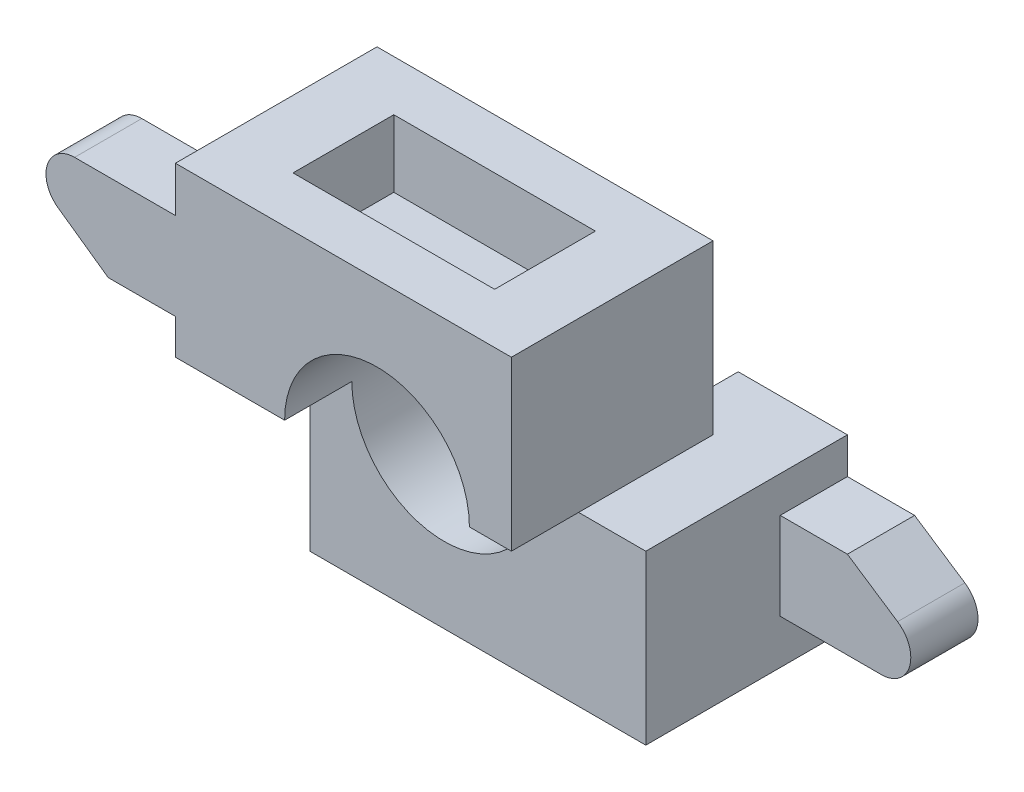
ISO-10303-21;
HEADER;
FILE_DESCRIPTION(('STEP AP214'),'2;1');
FILE_NAME('part.step','',(''),(''),'','','');
FILE_SCHEMA(('AUTOMOTIVE_DESIGN { 1 0 10303 214 1 1 1 1 }'));
ENDSEC;
DATA;
#1=APPLICATION_CONTEXT('core data for automotive mechanical design processes');
#2=APPLICATION_PROTOCOL_DEFINITION('international standard','automotive_design',2000,#1);
#3=PRODUCT_CONTEXT('',#1,'mechanical');
#4=PRODUCT('Part','Part','',(#3));
#5=PRODUCT_RELATED_PRODUCT_CATEGORY('part','',(#4));
#6=PRODUCT_DEFINITION_FORMATION('','',#4);
#7=PRODUCT_DEFINITION_CONTEXT('part definition',#1,'design');
#8=PRODUCT_DEFINITION('design','',#6,#7);
#9=PRODUCT_DEFINITION_SHAPE('','',#8);
#10=(LENGTH_UNIT() NAMED_UNIT(*) SI_UNIT(.MILLI.,.METRE.));
#11=(NAMED_UNIT(*) PLANE_ANGLE_UNIT() SI_UNIT($,.RADIAN.));
#12=(NAMED_UNIT(*) SI_UNIT($,.STERADIAN.) SOLID_ANGLE_UNIT());
#13=UNCERTAINTY_MEASURE_WITH_UNIT(LENGTH_MEASURE(1.E-05),#10,'distance_accuracy_value','');
#14=(GEOMETRIC_REPRESENTATION_CONTEXT(3) GLOBAL_UNCERTAINTY_ASSIGNED_CONTEXT((#13)) GLOBAL_UNIT_ASSIGNED_CONTEXT((#10,
#11,#12)) REPRESENTATION_CONTEXT('',''));
#15=CARTESIAN_POINT('',(0.,0.,0.));
#16=DIRECTION('',(0.,0.,1.));
#17=DIRECTION('',(1.,0.,0.));
#18=AXIS2_PLACEMENT_3D('',#15,#16,#17);
#19=CARTESIAN_POINT('',(0.,-10.7717179520605,-40.));
#20=DIRECTION('',(0.,-1.,0.));
#21=DIRECTION('',(1.,0.,0.));
#22=AXIS2_PLACEMENT_3D('',#19,#20,#21);
#23=PLANE('',#22);
#24=DIRECTION('',(-1.,0.,0.));
#25=VECTOR('',#24,1.);
#26=CARTESIAN_POINT('',(0.,-10.7717179520605,-20.));
#27=LINE('',#26,#25);
#28=CARTESIAN_POINT('',(80.,-10.7717179520605,-20.));
#29=VERTEX_POINT('',#28);
#30=CARTESIAN_POINT('',(60.,-10.7717179520605,-20.));
#31=VERTEX_POINT('',#30);
#32=EDGE_CURVE('E319',#29,#31,#27,.T.);
#33=ORIENTED_EDGE('',*,*,#32,.F.);
#34=DIRECTION('',(0.,0.,1.));
#35=VECTOR('',#34,1.);
#36=CARTESIAN_POINT('',(80.,-10.7717179520605,-40.));
#37=LINE('',#36,#35);
#38=CARTESIAN_POINT('',(80.,-10.7717179520605,-40.));
#39=VERTEX_POINT('',#38);
#40=EDGE_CURVE('E380',#39,#29,#37,.T.);
#41=ORIENTED_EDGE('',*,*,#40,.F.);
#42=DIRECTION('',(1.,0.,0.));
#43=VECTOR('',#42,1.);
#44=CARTESIAN_POINT('',(0.,-10.7717179520605,-40.));
#45=LINE('',#44,#43);
#46=CARTESIAN_POINT('',(60.,-10.7717179520605,-40.));
#47=VERTEX_POINT('',#46);
#48=EDGE_CURVE('E368',#47,#39,#45,.T.);
#49=ORIENTED_EDGE('',*,*,#48,.F.);
#50=DIRECTION('',(0.,0.,1.));
#51=VECTOR('',#50,1.);
#52=CARTESIAN_POINT('',(60.,-10.7717179520605,-40.));
#53=LINE('',#52,#51);
#54=EDGE_CURVE('E377',#47,#31,#53,.T.);
#55=ORIENTED_EDGE('',*,*,#54,.T.);
#56=EDGE_LOOP('',(#33,#41,#49,#55));
#57=FACE_BOUND('',#56,.T.);
#58=ADVANCED_FACE('F36',(#57),#23,.F.);
#59=CARTESIAN_POINT('',(19.5028414656665,29.3830059598299,-40.));
#60=DIRECTION('',(-0.553014165419757,-0.833171850727742,0.));
#61=DIRECTION('',(0.833171850727742,-0.553014165419757,0.));
#62=AXIS2_PLACEMENT_3D('',#59,#60,#61);
#63=PLANE('',#62);
#64=DIRECTION('',(-0.833171850727742,0.553014165419757,0.));
#65=VECTOR('',#64,1.);
#66=CARTESIAN_POINT('',(19.5028414656665,29.3830059598299,-20.));
#67=LINE('',#66,#65);
#68=CARTESIAN_POINT('',(94.9447578266245,-20.6912354797737,-20.));
#69=VERTEX_POINT('',#68);
#70=EDGE_CURVE('E313',#69,#29,#67,.T.);
#71=ORIENTED_EDGE('',*,*,#70,.F.);
#72=DIRECTION('',(0.,0.,1.));
#73=VECTOR('',#72,1.);
#74=CARTESIAN_POINT('',(94.9447578266245,-20.6912354797737,-40.));
#75=LINE('',#74,#73);
#76=CARTESIAN_POINT('',(94.9447578266245,-20.6912354797737,-40.));
#77=VERTEX_POINT('',#76);
#78=EDGE_CURVE('E383',#77,#69,#75,.T.);
#79=ORIENTED_EDGE('',*,*,#78,.F.);
#80=DIRECTION('',(0.833171850727742,-0.553014165419757,0.));
#81=VECTOR('',#80,1.);
#82=CARTESIAN_POINT('',(19.5028414656665,29.3830059598299,-40.));
#83=LINE('',#82,#81);
#84=EDGE_CURVE('E366',#39,#77,#83,.T.);
#85=ORIENTED_EDGE('',*,*,#84,.F.);
#86=ORIENTED_EDGE('',*,*,#40,.T.);
#87=EDGE_LOOP('',(#71,#79,#85,#86));
#88=FACE_BOUND('',#87,.T.);
#89=ADVANCED_FACE('F525',(#88),#63,.F.);
#90=CARTESIAN_POINT('',(90.0935973993104,-28.,-40.));
#91=DIRECTION('',(0.,0.,1.));
#92=DIRECTION('',(1.,0.,0.));
#93=AXIS2_PLACEMENT_3D('',#90,#91,#92);
#94=CYLINDRICAL_SURFACE('',#93,8.77221729687867);
#95=CARTESIAN_POINT('',(90.0935973993104,-28.,-20.));
#96=DIRECTION('',(0.,0.,1.));
#97=DIRECTION('',(1.,0.,0.));
#98=AXIS2_PLACEMENT_3D('',#95,#96,#97);
#99=CIRCLE('',#98,8.77221729687867);
#100=CARTESIAN_POINT('',(90.,-36.7717179520605,-20.));
#101=VERTEX_POINT('',#100);
#102=EDGE_CURVE('E327',#101,#69,#99,.T.);
#103=ORIENTED_EDGE('',*,*,#102,.F.);
#104=DIRECTION('',(0.,0.,1.));
#105=VECTOR('',#104,1.);
#106=CARTESIAN_POINT('',(90.,-36.7717179520605,-40.));
#107=LINE('',#106,#105);
#108=CARTESIAN_POINT('',(90.,-36.7717179520605,-40.));
#109=VERTEX_POINT('',#108);
#110=EDGE_CURVE('E386',#109,#101,#107,.T.);
#111=ORIENTED_EDGE('',*,*,#110,.F.);
#112=CARTESIAN_POINT('',(90.0935973993104,-28.,-40.));
#113=DIRECTION('',(0.,0.,1.));
#114=DIRECTION('',(1.,0.,0.));
#115=AXIS2_PLACEMENT_3D('',#112,#113,#114);
#116=CIRCLE('',#115,8.77221729687867);
#117=EDGE_CURVE('E364',#77,#109,#116,.F.);
#118=ORIENTED_EDGE('',*,*,#117,.F.);
#119=ORIENTED_EDGE('',*,*,#78,.T.);
#120=EDGE_LOOP('',(#103,#111,#118,#119));
#121=FACE_BOUND('',#120,.T.);
#122=ADVANCED_FACE('F521',(#121),#94,.T.);
#123=CARTESIAN_POINT('',(0.,-36.7717179520605,-40.));
#124=DIRECTION('',(0.,-1.,0.));
#125=DIRECTION('',(0.,0.,-1.));
#126=AXIS2_PLACEMENT_3D('',#123,#124,#125);
#127=PLANE('',#126);
#128=ORIENTED_EDGE('',*,*,#110,.T.);
#129=DIRECTION('',(-1.,0.,0.));
#130=VECTOR('',#129,1.);
#131=CARTESIAN_POINT('',(0.,-36.7717179520605,-20.));
#132=LINE('',#131,#130);
#133=CARTESIAN_POINT('',(60.,-36.7717179520605,-20.));
#134=VERTEX_POINT('',#133);
#135=EDGE_CURVE('E324',#101,#134,#132,.T.);
#136=ORIENTED_EDGE('',*,*,#135,.T.);
#137=DIRECTION('',(0.,0.,1.));
#138=VECTOR('',#137,1.);
#139=CARTESIAN_POINT('',(60.,-36.7717179520605,-40.));
#140=LINE('',#139,#138);
#141=CARTESIAN_POINT('',(60.,-36.7717179520605,-40.));
#142=VERTEX_POINT('',#141);
#143=EDGE_CURVE('E389',#142,#134,#140,.T.);
#144=ORIENTED_EDGE('',*,*,#143,.F.);
#145=DIRECTION('',(1.,0.,0.));
#146=VECTOR('',#145,1.);
#147=CARTESIAN_POINT('',(0.,-36.7717179520605,-40.));
#148=LINE('',#147,#146);
#149=EDGE_CURVE('E360',#142,#109,#148,.T.);
#150=ORIENTED_EDGE('',*,*,#149,.T.);
#151=EDGE_LOOP('',(#128,#136,#144,#150));
#152=FACE_BOUND('',#151,.T.);
#153=ADVANCED_FACE('F515',(#152),#127,.T.);
#154=CARTESIAN_POINT('',(0.,0.,-20.));
#155=DIRECTION('',(0.,0.,1.));
#156=DIRECTION('',(1.,0.,0.));
#157=AXIS2_PLACEMENT_3D('',#154,#155,#156);
#158=CYLINDRICAL_SURFACE('',#157,27.5);
#159=DIRECTION('',(0.,0.,1.));
#160=VECTOR('',#159,1.);
#161=CARTESIAN_POINT('',(-27.5,0.,-20.));
#162=LINE('',#161,#160);
#163=CARTESIAN_POINT('',(-27.5,0.,20.));
#164=VERTEX_POINT('',#163);
#165=CARTESIAN_POINT('',(-27.5,0.,40.));
#166=VERTEX_POINT('',#165);
#167=EDGE_CURVE('E12',#164,#166,#162,.T.);
#168=ORIENTED_EDGE('',*,*,#167,.F.);
#169=CARTESIAN_POINT('',(0.,0.,20.));
#170=DIRECTION('',(0.,0.,1.));
#171=DIRECTION('',(1.,0.,0.));
#172=AXIS2_PLACEMENT_3D('',#169,#170,#171);
#173=CIRCLE('',#172,27.5);
#174=CARTESIAN_POINT('',(27.5,0.,20.));
#175=VERTEX_POINT('',#174);
#176=EDGE_CURVE('E329',#164,#175,#173,.T.);
#177=ORIENTED_EDGE('',*,*,#176,.T.);
#178=DIRECTION('',(0.,0.,1.));
#179=VECTOR('',#178,1.);
#180=CARTESIAN_POINT('',(27.5,0.,-20.));
#181=LINE('',#180,#179);
#182=CARTESIAN_POINT('',(27.5,0.,40.));
#183=VERTEX_POINT('',#182);
#184=EDGE_CURVE('E40',#175,#183,#181,.T.);
#185=ORIENTED_EDGE('',*,*,#184,.T.);
#186=CARTESIAN_POINT('',(0.,0.,40.));
#187=DIRECTION('',(0.,0.,1.));
#188=DIRECTION('',(1.,0.,0.));
#189=AXIS2_PLACEMENT_3D('',#186,#187,#188);
#190=CIRCLE('',#189,27.5);
#191=EDGE_CURVE('E373',#183,#166,#190,.T.);
#192=ORIENTED_EDGE('',*,*,#191,.T.);
#193=EDGE_LOOP('',(#168,#177,#185,#192));
#194=FACE_BOUND('',#193,.T.);
#195=CARTESIAN_POINT('',(0.,0.,-20.));
#196=DIRECTION('',(0.,0.,1.));
#197=DIRECTION('',(1.,0.,0.));
#198=AXIS2_PLACEMENT_3D('',#195,#196,#197);
#199=CIRCLE('',#198,27.5);
#200=CARTESIAN_POINT('',(27.5,0.,-20.));
#201=VERTEX_POINT('',#200);
#202=CARTESIAN_POINT('',(-27.5,0.,-20.));
#203=VERTEX_POINT('',#202);
#204=EDGE_CURVE('E433',#201,#203,#199,.T.);
#205=ORIENTED_EDGE('',*,*,#204,.F.);
#206=DIRECTION('',(0.,0.,1.));
#207=VECTOR('',#206,1.);
#208=CARTESIAN_POINT('',(27.5,0.,-40.));
#209=LINE('',#208,#207);
#210=CARTESIAN_POINT('',(27.5,0.,-40.));
#211=VERTEX_POINT('',#210);
#212=EDGE_CURVE('E370',#211,#201,#209,.T.);
#213=ORIENTED_EDGE('',*,*,#212,.F.);
#214=CARTESIAN_POINT('',(0.,0.,-40.));
#215=DIRECTION('',(0.,0.,1.));
#216=DIRECTION('',(1.,0.,0.));
#217=AXIS2_PLACEMENT_3D('',#214,#215,#216);
#218=CIRCLE('',#217,27.5);
#219=CARTESIAN_POINT('',(-27.5,0.,-40.));
#220=VERTEX_POINT('',#219);
#221=EDGE_CURVE('E346',#220,#211,#218,.T.);
#222=ORIENTED_EDGE('',*,*,#221,.F.);
#223=DIRECTION('',(0.,0.,1.));
#224=VECTOR('',#223,1.);
#225=CARTESIAN_POINT('',(-27.5,0.,-40.));
#226=LINE('',#225,#224);
#227=EDGE_CURVE('E400',#220,#203,#226,.T.);
#228=ORIENTED_EDGE('',*,*,#227,.T.);
#229=EDGE_LOOP('',(#205,#213,#222,#228));
#230=FACE_BOUND('',#229,.T.);
#231=ADVANCED_FACE('F38',(#194,#230),#158,.F.);
#232=CARTESIAN_POINT('',(0.,0.,-20.));
#233=DIRECTION('',(0.,1.,0.));
#234=DIRECTION('',(-1.,0.,0.));
#235=AXIS2_PLACEMENT_3D('',#232,#233,#234);
#236=PLANE('',#235);
#237=DIRECTION('',(-1.,0.,0.));
#238=VECTOR('',#237,1.);
#239=CARTESIAN_POINT('',(0.,0.,-20.));
#240=LINE('',#239,#238);
#241=CARTESIAN_POINT('',(-40.,0.,-20.));
#242=VERTEX_POINT('',#241);
#243=CARTESIAN_POINT('',(-60.,0.,-20.));
#244=VERTEX_POINT('',#243);
#245=EDGE_CURVE('E447',#242,#244,#240,.T.);
#246=ORIENTED_EDGE('',*,*,#245,.F.);
#247=DIRECTION('',(0.,0.,1.));
#248=VECTOR('',#247,1.);
#249=CARTESIAN_POINT('',(-40.,0.,-40.));
#250=LINE('',#249,#248);
#251=CARTESIAN_POINT('',(-40.,0.,20.));
#252=VERTEX_POINT('',#251);
#253=EDGE_CURVE('E399',#242,#252,#250,.T.);
#254=ORIENTED_EDGE('',*,*,#253,.T.);
#255=DIRECTION('',(1.,0.,0.));
#256=VECTOR('',#255,1.);
#257=CARTESIAN_POINT('',(0.,0.,20.));
#258=LINE('',#257,#256);
#259=EDGE_CURVE('E333',#252,#164,#258,.T.);
#260=ORIENTED_EDGE('',*,*,#259,.T.);
#261=ORIENTED_EDGE('',*,*,#167,.T.);
#262=DIRECTION('',(-1.,0.,0.));
#263=VECTOR('',#262,1.);
#264=CARTESIAN_POINT('',(0.,0.,40.));
#265=LINE('',#264,#263);
#266=CARTESIAN_POINT('',(-60.,0.,40.));
#267=VERTEX_POINT('',#266);
#268=EDGE_CURVE('E430',#166,#267,#265,.T.);
#269=ORIENTED_EDGE('',*,*,#268,.T.);
#270=DIRECTION('',(0.,0.,1.));
#271=VECTOR('',#270,1.);
#272=CARTESIAN_POINT('',(-60.,0.,-20.));
#273=LINE('',#272,#271);
#274=EDGE_CURVE('E45',#244,#267,#273,.T.);
#275=ORIENTED_EDGE('',*,*,#274,.F.);
#276=EDGE_LOOP('',(#246,#254,#260,#261,#269,#275));
#277=FACE_BOUND('',#276,.T.);
#278=ADVANCED_FACE('F490',(#277),#236,.F.);
#279=CARTESIAN_POINT('',(-60.,0.,-20.));
#280=DIRECTION('',(1.,0.,0.));
#281=DIRECTION('',(0.,0.,-1.));
#282=AXIS2_PLACEMENT_3D('',#279,#280,#281);
#283=PLANE('',#282);
#284=ORIENTED_EDGE('',*,*,#274,.T.);
#285=DIRECTION('',(0.,1.,0.));
#286=VECTOR('',#285,1.);
#287=CARTESIAN_POINT('',(-60.,0.,40.));
#288=LINE('',#287,#286);
#289=CARTESIAN_POINT('',(-60.,10.5136614284726,40.));
#290=VERTEX_POINT('',#289);
#291=EDGE_CURVE('E418',#267,#290,#288,.T.);
#292=ORIENTED_EDGE('',*,*,#291,.T.);
#293=DIRECTION('',(0.,0.,1.));
#294=VECTOR('',#293,1.);
#295=CARTESIAN_POINT('',(-60.,10.5136614284726,-20.));
#296=LINE('',#295,#294);
#297=CARTESIAN_POINT('',(-60.,10.5136614284726,20.));
#298=VERTEX_POINT('',#297);
#299=EDGE_CURVE('E452',#298,#290,#296,.T.);
#300=ORIENTED_EDGE('',*,*,#299,.F.);
#301=DIRECTION('',(0.,1.,0.));
#302=VECTOR('',#301,1.);
#303=CARTESIAN_POINT('',(-60.,0.,20.));
#304=LINE('',#303,#302);
#305=CARTESIAN_POINT('',(-60.,36.5136614284726,20.));
#306=VERTEX_POINT('',#305);
#307=EDGE_CURVE('E308',#298,#306,#304,.T.);
#308=ORIENTED_EDGE('',*,*,#307,.T.);
#309=DIRECTION('',(0.,0.,1.));
#310=VECTOR('',#309,1.);
#311=CARTESIAN_POINT('',(-60.,36.5136614284726,-20.));
#312=LINE('',#311,#310);
#313=CARTESIAN_POINT('',(-60.,36.5136614284726,40.));
#314=VERTEX_POINT('',#313);
#315=EDGE_CURVE('E460',#306,#314,#312,.T.);
#316=ORIENTED_EDGE('',*,*,#315,.T.);
#317=CARTESIAN_POINT('',(-60.,50.,40.));
#318=VERTEX_POINT('',#317);
#319=EDGE_CURVE('E414',#314,#318,#288,.T.);
#320=ORIENTED_EDGE('',*,*,#319,.T.);
#321=DIRECTION('',(0.,0.,1.));
#322=VECTOR('',#321,1.);
#323=CARTESIAN_POINT('',(-60.,50.,-20.));
#324=LINE('',#323,#322);
#325=CARTESIAN_POINT('',(-60.,50.,-20.));
#326=VERTEX_POINT('',#325);
#327=EDGE_CURVE('E462',#326,#318,#324,.T.);
#328=ORIENTED_EDGE('',*,*,#327,.F.);
#329=DIRECTION('',(0.,1.,0.));
#330=VECTOR('',#329,1.);
#331=CARTESIAN_POINT('',(-60.,0.,-20.));
#332=LINE('',#331,#330);
#333=EDGE_CURVE('E445',#244,#326,#332,.T.);
#334=ORIENTED_EDGE('',*,*,#333,.F.);
#335=EDGE_LOOP('',(#284,#292,#300,#308,#316,#320,#328,#334));
#336=FACE_BOUND('',#335,.T.);
#337=ADVANCED_FACE('F546',(#336),#283,.F.);
#338=CARTESIAN_POINT('',(0.,10.5136614284726,-20.));
#339=DIRECTION('',(0.,1.,0.));
#340=DIRECTION('',(-1.,0.,0.));
#341=AXIS2_PLACEMENT_3D('',#338,#339,#340);
#342=PLANE('',#341);
#343=DIRECTION('',(0.,0.,1.));
#344=VECTOR('',#343,1.);
#345=CARTESIAN_POINT('',(-80.,10.5136614284726,-20.));
#346=LINE('',#345,#344);
#347=CARTESIAN_POINT('',(-80.,10.5136614284726,20.));
#348=VERTEX_POINT('',#347);
#349=CARTESIAN_POINT('',(-80.,10.5136614284726,40.));
#350=VERTEX_POINT('',#349);
#351=EDGE_CURVE('E454',#348,#350,#346,.T.);
#352=ORIENTED_EDGE('',*,*,#351,.F.);
#353=DIRECTION('',(-1.,0.,0.));
#354=VECTOR('',#353,1.);
#355=CARTESIAN_POINT('',(0.,10.5136614284726,20.));
#356=LINE('',#355,#354);
#357=EDGE_CURVE('E306',#298,#348,#356,.T.);
#358=ORIENTED_EDGE('',*,*,#357,.F.);
#359=ORIENTED_EDGE('',*,*,#299,.T.);
#360=DIRECTION('',(-1.,0.,0.));
#361=VECTOR('',#360,1.);
#362=CARTESIAN_POINT('',(0.,10.5136614284726,40.));
#363=LINE('',#362,#361);
#364=EDGE_CURVE('E427',#290,#350,#363,.T.);
#365=ORIENTED_EDGE('',*,*,#364,.T.);
#366=EDGE_LOOP('',(#352,#358,#359,#365));
#367=FACE_BOUND('',#366,.T.);
#368=ADVANCED_FACE('F561',(#367),#342,.F.);
#369=CARTESIAN_POINT('',(-21.6725627596517,-30.6839443658761,-20.));
#370=DIRECTION('',(0.576919615619184,0.81680092869304,0.));
#371=DIRECTION('',(-0.81680092869304,0.576919615619184,0.));
#372=AXIS2_PLACEMENT_3D('',#369,#370,#371);
#373=PLANE('',#372);
#374=DIRECTION('',(0.,0.,1.));
#375=VECTOR('',#374,1.);
#376=CARTESIAN_POINT('',(-94.9116982788263,21.0460334386454,-20.));
#377=LINE('',#376,#375);
#378=CARTESIAN_POINT('',(-94.9116982788263,21.0460334386454,20.));
#379=VERTEX_POINT('',#378);
#380=CARTESIAN_POINT('',(-94.9116982788263,21.0460334386454,40.));
#381=VERTEX_POINT('',#380);
#382=EDGE_CURVE('E456',#379,#381,#377,.T.);
#383=ORIENTED_EDGE('',*,*,#382,.F.);
#384=DIRECTION('',(-0.81680092869304,0.576919615619184,0.));
#385=VECTOR('',#384,1.);
#386=CARTESIAN_POINT('',(-21.6725627596517,-30.6839443658761,20.));
#387=LINE('',#386,#385);
#388=EDGE_CURVE('E300',#348,#379,#387,.T.);
#389=ORIENTED_EDGE('',*,*,#388,.F.);
#390=ORIENTED_EDGE('',*,*,#351,.T.);
#391=DIRECTION('',(-0.81680092869304,0.576919615619184,0.));
#392=VECTOR('',#391,1.);
#393=CARTESIAN_POINT('',(-21.6725627596517,-30.6839443658761,40.));
#394=LINE('',#393,#392);
#395=EDGE_CURVE('E424',#350,#381,#394,.T.);
#396=ORIENTED_EDGE('',*,*,#395,.T.);
#397=EDGE_LOOP('',(#383,#389,#390,#396));
#398=FACE_BOUND('',#397,.T.);
#399=ADVANCED_FACE('F558',(#398),#373,.F.);
#400=CARTESIAN_POINT('',(-90.,28.,-20.));
#401=DIRECTION('',(0.,0.,1.));
#402=DIRECTION('',(1.,0.,0.));
#403=AXIS2_PLACEMENT_3D('',#400,#401,#402);
#404=CYLINDRICAL_SURFACE('',#403,8.51366142847264);
#405=CARTESIAN_POINT('',(-90.,28.,20.));
#406=DIRECTION('',(0.,0.,1.));
#407=DIRECTION('',(1.,0.,0.));
#408=AXIS2_PLACEMENT_3D('',#405,#406,#407);
#409=CIRCLE('',#408,8.51366142847264);
#410=CARTESIAN_POINT('',(-90.0000000000002,36.5136614284726,20.));
#411=VERTEX_POINT('',#410);
#412=EDGE_CURVE('E310',#411,#379,#409,.T.);
#413=ORIENTED_EDGE('',*,*,#412,.T.);
#414=ORIENTED_EDGE('',*,*,#382,.T.);
#415=CARTESIAN_POINT('',(-90.,28.,40.));
#416=DIRECTION('',(0.,0.,1.));
#417=DIRECTION('',(1.,0.,0.));
#418=AXIS2_PLACEMENT_3D('',#415,#416,#417);
#419=CIRCLE('',#418,8.51366142847264);
#420=CARTESIAN_POINT('',(-90.0000000000002,36.5136614284726,40.));
#421=VERTEX_POINT('',#420);
#422=EDGE_CURVE('E421',#421,#381,#419,.T.);
#423=ORIENTED_EDGE('',*,*,#422,.F.);
#424=DIRECTION('',(0.,0.,1.));
#425=VECTOR('',#424,1.);
#426=CARTESIAN_POINT('',(-90.0000000000002,36.5136614284726,-20.));
#427=LINE('',#426,#425);
#428=EDGE_CURVE('E458',#411,#421,#427,.T.);
#429=ORIENTED_EDGE('',*,*,#428,.F.);
#430=EDGE_LOOP('',(#413,#414,#423,#429));
#431=FACE_BOUND('',#430,.T.);
#432=ADVANCED_FACE('F554',(#431),#404,.T.);
#433=CARTESIAN_POINT('',(0.,36.5136614284726,-20.));
#434=DIRECTION('',(0.,1.,0.));
#435=DIRECTION('',(0.,0.,1.));
#436=AXIS2_PLACEMENT_3D('',#433,#434,#435);
#437=PLANE('',#436);
#438=DIRECTION('',(-1.,0.,0.));
#439=VECTOR('',#438,1.);
#440=CARTESIAN_POINT('',(0.,36.5136614284726,20.));
#441=LINE('',#440,#439);
#442=EDGE_CURVE('E314',#306,#411,#441,.T.);
#443=ORIENTED_EDGE('',*,*,#442,.T.);
#444=ORIENTED_EDGE('',*,*,#428,.T.);
#445=DIRECTION('',(-1.,0.,0.));
#446=VECTOR('',#445,1.);
#447=CARTESIAN_POINT('',(0.,36.5136614284726,40.));
#448=LINE('',#447,#446);
#449=EDGE_CURVE('E417',#314,#421,#448,.T.);
#450=ORIENTED_EDGE('',*,*,#449,.F.);
#451=ORIENTED_EDGE('',*,*,#315,.F.);
#452=EDGE_LOOP('',(#443,#444,#450,#451));
#453=FACE_BOUND('',#452,.T.);
#454=ADVANCED_FACE('F565',(#453),#437,.T.);
#455=CARTESIAN_POINT('',(0.,50.,-20.));
#456=DIRECTION('',(0.,1.,0.));
#457=DIRECTION('',(-1.,0.,0.));
#458=AXIS2_PLACEMENT_3D('',#455,#456,#457);
#459=PLANE('',#458);
#460=DIRECTION('',(1.,0.,0.));
#461=VECTOR('',#460,1.);
#462=CARTESIAN_POINT('',(0.,50.,25.));
#463=LINE('',#462,#461);
#464=CARTESIAN_POINT('',(-40.,50.,25.));
#465=VERTEX_POINT('',#464);
#466=CARTESIAN_POINT('',(20.,50.,25.));
#467=VERTEX_POINT('',#466);
#468=EDGE_CURVE('E61',#465,#467,#463,.T.);
#469=ORIENTED_EDGE('',*,*,#468,.F.);
#470=DIRECTION('',(0.,0.,-1.));
#471=VECTOR('',#470,1.);
#472=CARTESIAN_POINT('',(-40.,50.,0.));
#473=LINE('',#472,#471);
#474=CARTESIAN_POINT('',(-40.,50.,-5.));
#475=VERTEX_POINT('',#474);
#476=EDGE_CURVE('E281',#465,#475,#473,.T.);
#477=ORIENTED_EDGE('',*,*,#476,.T.);
#478=DIRECTION('',(1.,0.,0.));
#479=VECTOR('',#478,1.);
#480=CARTESIAN_POINT('',(0.,50.,-5.));
#481=LINE('',#480,#479);
#482=CARTESIAN_POINT('',(20.,50.,-5.));
#483=VERTEX_POINT('',#482);
#484=EDGE_CURVE('E293',#475,#483,#481,.T.);
#485=ORIENTED_EDGE('',*,*,#484,.T.);
#486=DIRECTION('',(0.,0.,-1.));
#487=VECTOR('',#486,1.);
#488=CARTESIAN_POINT('',(20.,50.,0.));
#489=LINE('',#488,#487);
#490=EDGE_CURVE('E290',#467,#483,#489,.T.);
#491=ORIENTED_EDGE('',*,*,#490,.F.);
#492=EDGE_LOOP('',(#469,#477,#485,#491));
#493=FACE_BOUND('',#492,.T.);
#494=ORIENTED_EDGE('',*,*,#327,.T.);
#495=DIRECTION('',(-1.,0.,0.));
#496=VECTOR('',#495,1.);
#497=CARTESIAN_POINT('',(0.,50.,40.));
#498=LINE('',#497,#496);
#499=CARTESIAN_POINT('',(40.,50.,40.));
#500=VERTEX_POINT('',#499);
#501=EDGE_CURVE('E411',#500,#318,#498,.T.);
#502=ORIENTED_EDGE('',*,*,#501,.F.);
#503=DIRECTION('',(0.,0.,1.));
#504=VECTOR('',#503,1.);
#505=CARTESIAN_POINT('',(40.,50.,-20.));
#506=LINE('',#505,#504);
#507=CARTESIAN_POINT('',(40.,50.,-20.));
#508=VERTEX_POINT('',#507);
#509=EDGE_CURVE('E464',#508,#500,#506,.T.);
#510=ORIENTED_EDGE('',*,*,#509,.F.);
#511=DIRECTION('',(-1.,0.,0.));
#512=VECTOR('',#511,1.);
#513=CARTESIAN_POINT('',(0.,50.,-20.));
#514=LINE('',#513,#512);
#515=EDGE_CURVE('E442',#508,#326,#514,.T.);
#516=ORIENTED_EDGE('',*,*,#515,.T.);
#517=EDGE_LOOP('',(#494,#502,#510,#516));
#518=FACE_BOUND('',#517,.T.);
#519=ADVANCED_FACE('F543',(#493,#518),#459,.T.);
#520=CARTESIAN_POINT('',(40.,0.,-20.));
#521=DIRECTION('',(1.,0.,0.));
#522=DIRECTION('',(0.,0.,-1.));
#523=AXIS2_PLACEMENT_3D('',#520,#521,#522);
#524=PLANE('',#523);
#525=ORIENTED_EDGE('',*,*,#509,.T.);
#526=DIRECTION('',(0.,1.,0.));
#527=VECTOR('',#526,1.);
#528=CARTESIAN_POINT('',(40.,0.,40.));
#529=LINE('',#528,#527);
#530=CARTESIAN_POINT('',(40.,0.,40.));
#531=VERTEX_POINT('',#530);
#532=EDGE_CURVE('E408',#531,#500,#529,.T.);
#533=ORIENTED_EDGE('',*,*,#532,.F.);
#534=DIRECTION('',(0.,0.,1.));
#535=VECTOR('',#534,1.);
#536=CARTESIAN_POINT('',(40.,0.,-20.));
#537=LINE('',#536,#535);
#538=CARTESIAN_POINT('',(40.,0.,20.));
#539=VERTEX_POINT('',#538);
#540=EDGE_CURVE('E467',#539,#531,#537,.T.);
#541=ORIENTED_EDGE('',*,*,#540,.F.);
#542=CARTESIAN_POINT('',(40.,0.,-20.));
#543=VERTEX_POINT('',#542);
#544=EDGE_CURVE('E465',#543,#539,#537,.T.);
#545=ORIENTED_EDGE('',*,*,#544,.F.);
#546=DIRECTION('',(0.,1.,0.));
#547=VECTOR('',#546,1.);
#548=CARTESIAN_POINT('',(40.,0.,-20.));
#549=LINE('',#548,#547);
#550=EDGE_CURVE('E439',#543,#508,#549,.T.);
#551=ORIENTED_EDGE('',*,*,#550,.T.);
#552=EDGE_LOOP('',(#525,#533,#541,#545,#551));
#553=FACE_BOUND('',#552,.T.);
#554=ADVANCED_FACE('F539',(#553),#524,.T.);
#555=CARTESIAN_POINT('',(0.,0.,-20.));
#556=DIRECTION('',(0.,-1.,0.));
#557=DIRECTION('',(0.,0.,-1.));
#558=AXIS2_PLACEMENT_3D('',#555,#556,#557);
#559=PLANE('',#558);
#560=EDGE_CURVE('E338',#175,#539,#258,.T.);
#561=ORIENTED_EDGE('',*,*,#560,.T.);
#562=ORIENTED_EDGE('',*,*,#540,.T.);
#563=DIRECTION('',(1.,0.,0.));
#564=VECTOR('',#563,1.);
#565=CARTESIAN_POINT('',(0.,0.,40.));
#566=LINE('',#565,#564);
#567=EDGE_CURVE('E405',#183,#531,#566,.T.);
#568=ORIENTED_EDGE('',*,*,#567,.F.);
#569=ORIENTED_EDGE('',*,*,#184,.F.);
#570=EDGE_LOOP('',(#561,#562,#568,#569));
#571=FACE_BOUND('',#570,.T.);
#572=ADVANCED_FACE('F480',(#571),#559,.T.);
#573=CARTESIAN_POINT('',(0.,0.,-20.));
#574=DIRECTION('',(0.,0.,1.));
#575=DIRECTION('',(1.,0.,0.));
#576=AXIS2_PLACEMENT_3D('',#573,#574,#575);
#577=PLANE('',#576);
#578=ORIENTED_EDGE('',*,*,#245,.T.);
#579=ORIENTED_EDGE('',*,*,#333,.T.);
#580=ORIENTED_EDGE('',*,*,#515,.F.);
#581=ORIENTED_EDGE('',*,*,#550,.F.);
#582=DIRECTION('',(1.,0.,0.));
#583=VECTOR('',#582,1.);
#584=CARTESIAN_POINT('',(0.,0.,-20.));
#585=LINE('',#584,#583);
#586=EDGE_CURVE('E436',#201,#543,#585,.T.);
#587=ORIENTED_EDGE('',*,*,#586,.F.);
#588=ORIENTED_EDGE('',*,*,#204,.T.);
#589=EDGE_CURVE('E448',#203,#242,#240,.T.);
#590=ORIENTED_EDGE('',*,*,#589,.T.);
#591=EDGE_LOOP('',(#578,#579,#580,#581,#587,#588,#590));
#592=FACE_BOUND('',#591,.T.);
#593=ADVANCED_FACE('F536',(#592),#577,.F.);
#594=CARTESIAN_POINT('',(0.,0.,40.));
#595=DIRECTION('',(0.,0.,1.));
#596=DIRECTION('',(1.,0.,0.));
#597=AXIS2_PLACEMENT_3D('',#594,#595,#596);
#598=PLANE('',#597);
#599=ORIENTED_EDGE('',*,*,#191,.F.);
#600=ORIENTED_EDGE('',*,*,#567,.T.);
#601=ORIENTED_EDGE('',*,*,#532,.T.);
#602=ORIENTED_EDGE('',*,*,#501,.T.);
#603=ORIENTED_EDGE('',*,*,#319,.F.);
#604=ORIENTED_EDGE('',*,*,#449,.T.);
#605=ORIENTED_EDGE('',*,*,#422,.T.);
#606=ORIENTED_EDGE('',*,*,#395,.F.);
#607=ORIENTED_EDGE('',*,*,#364,.F.);
#608=ORIENTED_EDGE('',*,*,#291,.F.);
#609=ORIENTED_EDGE('',*,*,#268,.F.);
#610=EDGE_LOOP('',(#599,#600,#601,#602,#603,#604,#605,#606,#607,#608,#609));
#611=FACE_BOUND('',#610,.T.);
#612=ADVANCED_FACE('F483',(#611),#598,.T.);
#613=CARTESIAN_POINT('',(0.,0.,-40.));
#614=DIRECTION('',(0.,-1.,0.));
#615=DIRECTION('',(0.,0.,-1.));
#616=AXIS2_PLACEMENT_3D('',#613,#614,#615);
#617=PLANE('',#616);
#618=CARTESIAN_POINT('',(-40.,0.,-40.));
#619=VERTEX_POINT('',#618);
#620=EDGE_CURVE('E397',#619,#242,#250,.T.);
#621=ORIENTED_EDGE('',*,*,#620,.T.);
#622=ORIENTED_EDGE('',*,*,#589,.F.);
#623=ORIENTED_EDGE('',*,*,#227,.F.);
#624=DIRECTION('',(1.,0.,0.));
#625=VECTOR('',#624,1.);
#626=CARTESIAN_POINT('',(0.,0.,-40.));
#627=LINE('',#626,#625);
#628=EDGE_CURVE('E349',#619,#220,#627,.T.);
#629=ORIENTED_EDGE('',*,*,#628,.F.);
#630=EDGE_LOOP('',(#621,#622,#623,#629));
#631=FACE_BOUND('',#630,.T.);
#632=ADVANCED_FACE('F601',(#631),#617,.F.);
#633=ORIENTED_EDGE('',*,*,#544,.T.);
#634=CARTESIAN_POINT('',(60.,0.,20.));
#635=VERTEX_POINT('',#634);
#636=EDGE_CURVE('E337',#539,#635,#258,.T.);
#637=ORIENTED_EDGE('',*,*,#636,.T.);
#638=DIRECTION('',(0.,0.,1.));
#639=VECTOR('',#638,1.);
#640=CARTESIAN_POINT('',(60.,0.,-40.));
#641=LINE('',#640,#639);
#642=CARTESIAN_POINT('',(60.,0.,-40.));
#643=VERTEX_POINT('',#642);
#644=EDGE_CURVE('E374',#643,#635,#641,.T.);
#645=ORIENTED_EDGE('',*,*,#644,.F.);
#646=EDGE_CURVE('E352',#211,#643,#627,.T.);
#647=ORIENTED_EDGE('',*,*,#646,.F.);
#648=ORIENTED_EDGE('',*,*,#212,.T.);
#649=ORIENTED_EDGE('',*,*,#586,.T.);
#650=EDGE_LOOP('',(#633,#637,#645,#647,#648,#649));
#651=FACE_BOUND('',#650,.T.);
#652=ADVANCED_FACE('F499',(#651),#617,.F.);
#653=CARTESIAN_POINT('',(60.,0.,-40.));
#654=DIRECTION('',(-1.,0.,0.));
#655=DIRECTION('',(0.,-1.,0.));
#656=AXIS2_PLACEMENT_3D('',#653,#654,#655);
#657=PLANE('',#656);
#658=ORIENTED_EDGE('',*,*,#644,.T.);
#659=DIRECTION('',(0.,-1.,0.));
#660=VECTOR('',#659,1.);
#661=CARTESIAN_POINT('',(60.,0.,20.));
#662=LINE('',#661,#660);
#663=CARTESIAN_POINT('',(60.,-50.,20.));
#664=VERTEX_POINT('',#663);
#665=EDGE_CURVE('E344',#635,#664,#662,.T.);
#666=ORIENTED_EDGE('',*,*,#665,.T.);
#667=DIRECTION('',(0.,0.,1.));
#668=VECTOR('',#667,1.);
#669=CARTESIAN_POINT('',(60.,-50.,-40.));
#670=LINE('',#669,#668);
#671=CARTESIAN_POINT('',(60.,-50.,-40.));
#672=VERTEX_POINT('',#671);
#673=EDGE_CURVE('E392',#672,#664,#670,.T.);
#674=ORIENTED_EDGE('',*,*,#673,.F.);
#675=DIRECTION('',(0.,-1.,0.));
#676=VECTOR('',#675,1.);
#677=CARTESIAN_POINT('',(60.,0.,-40.));
#678=LINE('',#677,#676);
#679=EDGE_CURVE('E358',#142,#672,#678,.T.);
#680=ORIENTED_EDGE('',*,*,#679,.F.);
#681=ORIENTED_EDGE('',*,*,#143,.T.);
#682=DIRECTION('',(0.,1.,0.));
#683=VECTOR('',#682,1.);
#684=CARTESIAN_POINT('',(60.,0.,-20.));
#685=LINE('',#684,#683);
#686=EDGE_CURVE('E322',#134,#31,#685,.T.);
#687=ORIENTED_EDGE('',*,*,#686,.T.);
#688=ORIENTED_EDGE('',*,*,#54,.F.);
#689=EDGE_CURVE('E361',#643,#47,#678,.T.);
#690=ORIENTED_EDGE('',*,*,#689,.F.);
#691=EDGE_LOOP('',(#658,#666,#674,#680,#681,#687,#688,#690));
#692=FACE_BOUND('',#691,.T.);
#693=ADVANCED_FACE('F502',(#692),#657,.F.);
#694=CARTESIAN_POINT('',(0.,-50.,-40.));
#695=DIRECTION('',(0.,-1.,0.));
#696=DIRECTION('',(0.,0.,-1.));
#697=AXIS2_PLACEMENT_3D('',#694,#695,#696);
#698=PLANE('',#697);
#699=DIRECTION('',(1.,0.,0.));
#700=VECTOR('',#699,1.);
#701=CARTESIAN_POINT('',(0.,-50.,-25.));
#702=LINE('',#701,#700);
#703=CARTESIAN_POINT('',(-20.,-50.,-25.));
#704=VERTEX_POINT('',#703);
#705=CARTESIAN_POINT('',(40.,-50.,-25.));
#706=VERTEX_POINT('',#705);
#707=EDGE_CURVE('E53',#704,#706,#702,.T.);
#708=ORIENTED_EDGE('',*,*,#707,.F.);
#709=DIRECTION('',(0.,0.,1.));
#710=VECTOR('',#709,1.);
#711=CARTESIAN_POINT('',(-20.,-50.,0.));
#712=LINE('',#711,#710);
#713=CARTESIAN_POINT('',(-20.,-50.,5.));
#714=VERTEX_POINT('',#713);
#715=EDGE_CURVE('E259',#704,#714,#712,.T.);
#716=ORIENTED_EDGE('',*,*,#715,.T.);
#717=DIRECTION('',(1.,0.,0.));
#718=VECTOR('',#717,1.);
#719=CARTESIAN_POINT('',(0.,-50.,5.));
#720=LINE('',#719,#718);
#721=CARTESIAN_POINT('',(40.,-50.,5.));
#722=VERTEX_POINT('',#721);
#723=EDGE_CURVE('E262',#714,#722,#720,.T.);
#724=ORIENTED_EDGE('',*,*,#723,.T.);
#725=DIRECTION('',(0.,0.,1.));
#726=VECTOR('',#725,1.);
#727=CARTESIAN_POINT('',(40.,-50.,0.));
#728=LINE('',#727,#726);
#729=EDGE_CURVE('E268',#706,#722,#728,.T.);
#730=ORIENTED_EDGE('',*,*,#729,.F.);
#731=EDGE_LOOP('',(#708,#716,#724,#730));
#732=FACE_BOUND('',#731,.T.);
#733=ORIENTED_EDGE('',*,*,#673,.T.);
#734=DIRECTION('',(1.,0.,0.));
#735=VECTOR('',#734,1.);
#736=CARTESIAN_POINT('',(0.,-50.,20.));
#737=LINE('',#736,#735);
#738=CARTESIAN_POINT('',(-40.,-50.,20.));
#739=VERTEX_POINT('',#738);
#740=EDGE_CURVE('E341',#739,#664,#737,.T.);
#741=ORIENTED_EDGE('',*,*,#740,.F.);
#742=DIRECTION('',(0.,0.,1.));
#743=VECTOR('',#742,1.);
#744=CARTESIAN_POINT('',(-40.,-50.,-40.));
#745=LINE('',#744,#743);
#746=CARTESIAN_POINT('',(-40.,-50.,-40.));
#747=VERTEX_POINT('',#746);
#748=EDGE_CURVE('E395',#747,#739,#745,.T.);
#749=ORIENTED_EDGE('',*,*,#748,.F.);
#750=DIRECTION('',(1.,0.,0.));
#751=VECTOR('',#750,1.);
#752=CARTESIAN_POINT('',(0.,-50.,-40.));
#753=LINE('',#752,#751);
#754=EDGE_CURVE('E355',#747,#672,#753,.T.);
#755=ORIENTED_EDGE('',*,*,#754,.T.);
#756=EDGE_LOOP('',(#733,#741,#749,#755));
#757=FACE_BOUND('',#756,.T.);
#758=ADVANCED_FACE('F506',(#732,#757),#698,.T.);
#759=CARTESIAN_POINT('',(-40.,0.,-40.));
#760=DIRECTION('',(-1.,0.,0.));
#761=DIRECTION('',(0.,0.,1.));
#762=AXIS2_PLACEMENT_3D('',#759,#760,#761);
#763=PLANE('',#762);
#764=ORIENTED_EDGE('',*,*,#748,.T.);
#765=DIRECTION('',(0.,-1.,0.));
#766=VECTOR('',#765,1.);
#767=CARTESIAN_POINT('',(-40.,0.,20.));
#768=LINE('',#767,#766);
#769=EDGE_CURVE('E336',#252,#739,#768,.T.);
#770=ORIENTED_EDGE('',*,*,#769,.F.);
#771=ORIENTED_EDGE('',*,*,#253,.F.);
#772=ORIENTED_EDGE('',*,*,#620,.F.);
#773=DIRECTION('',(0.,-1.,0.));
#774=VECTOR('',#773,1.);
#775=CARTESIAN_POINT('',(-40.,0.,-40.));
#776=LINE('',#775,#774);
#777=EDGE_CURVE('E351',#619,#747,#776,.T.);
#778=ORIENTED_EDGE('',*,*,#777,.T.);
#779=EDGE_LOOP('',(#764,#770,#771,#772,#778));
#780=FACE_BOUND('',#779,.T.);
#781=ADVANCED_FACE('F594',(#780),#763,.T.);
#782=CARTESIAN_POINT('',(0.,0.,-40.));
#783=DIRECTION('',(0.,0.,1.));
#784=DIRECTION('',(1.,0.,0.));
#785=AXIS2_PLACEMENT_3D('',#782,#783,#784);
#786=PLANE('',#785);
#787=ORIENTED_EDGE('',*,*,#221,.T.);
#788=ORIENTED_EDGE('',*,*,#646,.T.);
#789=ORIENTED_EDGE('',*,*,#689,.T.);
#790=ORIENTED_EDGE('',*,*,#48,.T.);
#791=ORIENTED_EDGE('',*,*,#84,.T.);
#792=ORIENTED_EDGE('',*,*,#117,.T.);
#793=ORIENTED_EDGE('',*,*,#149,.F.);
#794=ORIENTED_EDGE('',*,*,#679,.T.);
#795=ORIENTED_EDGE('',*,*,#754,.F.);
#796=ORIENTED_EDGE('',*,*,#777,.F.);
#797=ORIENTED_EDGE('',*,*,#628,.T.);
#798=EDGE_LOOP('',(#787,#788,#789,#790,#791,#792,#793,#794,#795,#796,#797));
#799=FACE_BOUND('',#798,.T.);
#800=ADVANCED_FACE('F511',(#799),#786,.F.);
#801=CARTESIAN_POINT('',(0.,0.,20.));
#802=DIRECTION('',(0.,0.,1.));
#803=DIRECTION('',(1.,0.,0.));
#804=AXIS2_PLACEMENT_3D('',#801,#802,#803);
#805=PLANE('',#804);
#806=ORIENTED_EDGE('',*,*,#740,.T.);
#807=ORIENTED_EDGE('',*,*,#665,.F.);
#808=ORIENTED_EDGE('',*,*,#636,.F.);
#809=ORIENTED_EDGE('',*,*,#560,.F.);
#810=ORIENTED_EDGE('',*,*,#176,.F.);
#811=ORIENTED_EDGE('',*,*,#259,.F.);
#812=ORIENTED_EDGE('',*,*,#769,.T.);
#813=EDGE_LOOP('',(#806,#807,#808,#809,#810,#811,#812));
#814=FACE_BOUND('',#813,.T.);
#815=ADVANCED_FACE('F495',(#814),#805,.T.);
#816=CARTESIAN_POINT('',(0.,0.,-20.));
#817=DIRECTION('',(0.,0.,1.));
#818=DIRECTION('',(1.,0.,0.));
#819=AXIS2_PLACEMENT_3D('',#816,#817,#818);
#820=PLANE('',#819);
#821=ORIENTED_EDGE('',*,*,#135,.F.);
#822=ORIENTED_EDGE('',*,*,#102,.T.);
#823=ORIENTED_EDGE('',*,*,#70,.T.);
#824=ORIENTED_EDGE('',*,*,#32,.T.);
#825=ORIENTED_EDGE('',*,*,#686,.F.);
#826=EDGE_LOOP('',(#821,#822,#823,#824,#825));
#827=FACE_BOUND('',#826,.T.);
#828=ADVANCED_FACE('F518',(#827),#820,.T.);
#829=CARTESIAN_POINT('',(0.,0.,20.));
#830=DIRECTION('',(0.,0.,1.));
#831=DIRECTION('',(1.,0.,0.));
#832=AXIS2_PLACEMENT_3D('',#829,#830,#831);
#833=PLANE('',#832);
#834=ORIENTED_EDGE('',*,*,#307,.F.);
#835=ORIENTED_EDGE('',*,*,#357,.T.);
#836=ORIENTED_EDGE('',*,*,#388,.T.);
#837=ORIENTED_EDGE('',*,*,#412,.F.);
#838=ORIENTED_EDGE('',*,*,#442,.F.);
#839=EDGE_LOOP('',(#834,#835,#836,#837,#838));
#840=FACE_BOUND('',#839,.T.);
#841=ADVANCED_FACE('F566',(#840),#833,.F.);
#842=CARTESIAN_POINT('',(0.,30.,25.));
#843=DIRECTION('',(0.,0.,1.));
#844=DIRECTION('',(1.,0.,0.));
#845=AXIS2_PLACEMENT_3D('',#842,#843,#844);
#846=PLANE('',#845);
#847=ORIENTED_EDGE('',*,*,#468,.T.);
#848=DIRECTION('',(0.,1.,0.));
#849=VECTOR('',#848,1.);
#850=CARTESIAN_POINT('',(20.,30.,25.));
#851=LINE('',#850,#849);
#852=CARTESIAN_POINT('',(20.,30.,25.));
#853=VERTEX_POINT('',#852);
#854=EDGE_CURVE('E288',#853,#467,#851,.T.);
#855=ORIENTED_EDGE('',*,*,#854,.F.);
#856=DIRECTION('',(1.,0.,0.));
#857=VECTOR('',#856,1.);
#858=CARTESIAN_POINT('',(0.,30.,25.));
#859=LINE('',#858,#857);
#860=CARTESIAN_POINT('',(-40.,30.,25.));
#861=VERTEX_POINT('',#860);
#862=EDGE_CURVE('E277',#861,#853,#859,.T.);
#863=ORIENTED_EDGE('',*,*,#862,.F.);
#864=DIRECTION('',(0.,1.,0.));
#865=VECTOR('',#864,1.);
#866=CARTESIAN_POINT('',(-40.,30.,25.));
#867=LINE('',#866,#865);
#868=EDGE_CURVE('E298',#861,#465,#867,.T.);
#869=ORIENTED_EDGE('',*,*,#868,.T.);
#870=EDGE_LOOP('',(#847,#855,#863,#869));
#871=FACE_BOUND('',#870,.T.);
#872=ADVANCED_FACE('F568',(#871),#846,.F.);
#873=CARTESIAN_POINT('',(-40.,30.,0.));
#874=DIRECTION('',(1.,0.,0.));
#875=DIRECTION('',(0.,1.,0.));
#876=AXIS2_PLACEMENT_3D('',#873,#874,#875);
#877=PLANE('',#876);
#878=ORIENTED_EDGE('',*,*,#476,.F.);
#879=ORIENTED_EDGE('',*,*,#868,.F.);
#880=DIRECTION('',(0.,0.,-1.));
#881=VECTOR('',#880,1.);
#882=CARTESIAN_POINT('',(-40.,30.,0.));
#883=LINE('',#882,#881);
#884=CARTESIAN_POINT('',(-40.,30.,-5.));
#885=VERTEX_POINT('',#884);
#886=EDGE_CURVE('E286',#861,#885,#883,.T.);
#887=ORIENTED_EDGE('',*,*,#886,.T.);
#888=DIRECTION('',(0.,1.,0.));
#889=VECTOR('',#888,1.);
#890=CARTESIAN_POINT('',(-40.,30.,-5.));
#891=LINE('',#890,#889);
#892=EDGE_CURVE('E301',#885,#475,#891,.T.);
#893=ORIENTED_EDGE('',*,*,#892,.T.);
#894=EDGE_LOOP('',(#878,#879,#887,#893));
#895=FACE_BOUND('',#894,.T.);
#896=ADVANCED_FACE('F575',(#895),#877,.T.);
#897=CARTESIAN_POINT('',(0.,30.,-5.));
#898=DIRECTION('',(0.,0.,1.));
#899=DIRECTION('',(1.,0.,0.));
#900=AXIS2_PLACEMENT_3D('',#897,#898,#899);
#901=PLANE('',#900);
#902=ORIENTED_EDGE('',*,*,#484,.F.);
#903=ORIENTED_EDGE('',*,*,#892,.F.);
#904=DIRECTION('',(1.,0.,0.));
#905=VECTOR('',#904,1.);
#906=CARTESIAN_POINT('',(0.,30.,-5.));
#907=LINE('',#906,#905);
#908=CARTESIAN_POINT('',(20.,30.,-5.));
#909=VERTEX_POINT('',#908);
#910=EDGE_CURVE('E284',#885,#909,#907,.T.);
#911=ORIENTED_EDGE('',*,*,#910,.T.);
#912=DIRECTION('',(0.,1.,0.));
#913=VECTOR('',#912,1.);
#914=CARTESIAN_POINT('',(20.,30.,-5.));
#915=LINE('',#914,#913);
#916=EDGE_CURVE('E303',#909,#483,#915,.T.);
#917=ORIENTED_EDGE('',*,*,#916,.T.);
#918=EDGE_LOOP('',(#902,#903,#911,#917));
#919=FACE_BOUND('',#918,.T.);
#920=ADVANCED_FACE('F863',(#919),#901,.T.);
#921=CARTESIAN_POINT('',(20.,30.,0.));
#922=DIRECTION('',(1.,0.,0.));
#923=DIRECTION('',(0.,1.,0.));
#924=AXIS2_PLACEMENT_3D('',#921,#922,#923);
#925=PLANE('',#924);
#926=ORIENTED_EDGE('',*,*,#490,.T.);
#927=ORIENTED_EDGE('',*,*,#916,.F.);
#928=DIRECTION('',(0.,0.,-1.));
#929=VECTOR('',#928,1.);
#930=CARTESIAN_POINT('',(20.,30.,0.));
#931=LINE('',#930,#929);
#932=EDGE_CURVE('E280',#853,#909,#931,.T.);
#933=ORIENTED_EDGE('',*,*,#932,.F.);
#934=ORIENTED_EDGE('',*,*,#854,.T.);
#935=EDGE_LOOP('',(#926,#927,#933,#934));
#936=FACE_BOUND('',#935,.T.);
#937=ADVANCED_FACE('F872',(#936),#925,.F.);
#938=CARTESIAN_POINT('',(0.,30.,0.));
#939=DIRECTION('',(0.,1.,0.));
#940=DIRECTION('',(-1.,0.,0.));
#941=AXIS2_PLACEMENT_3D('',#938,#939,#940);
#942=PLANE('',#941);
#943=ORIENTED_EDGE('',*,*,#862,.T.);
#944=ORIENTED_EDGE('',*,*,#932,.T.);
#945=ORIENTED_EDGE('',*,*,#910,.F.);
#946=ORIENTED_EDGE('',*,*,#886,.F.);
#947=EDGE_LOOP('',(#943,#944,#945,#946));
#948=FACE_BOUND('',#947,.T.);
#949=ADVANCED_FACE('F880',(#948),#942,.T.);
#950=CARTESIAN_POINT('',(0.,-30.,-25.));
#951=DIRECTION('',(0.,0.,-1.));
#952=DIRECTION('',(-1.,0.,0.));
#953=AXIS2_PLACEMENT_3D('',#950,#951,#952);
#954=PLANE('',#953);
#955=ORIENTED_EDGE('',*,*,#707,.T.);
#956=DIRECTION('',(0.,-1.,0.));
#957=VECTOR('',#956,1.);
#958=CARTESIAN_POINT('',(40.,-30.,-25.));
#959=LINE('',#958,#957);
#960=CARTESIAN_POINT('',(40.,-30.,-25.));
#961=VERTEX_POINT('',#960);
#962=EDGE_CURVE('E238',#961,#706,#959,.T.);
#963=ORIENTED_EDGE('',*,*,#962,.F.);
#964=DIRECTION('',(1.,0.,0.));
#965=VECTOR('',#964,1.);
#966=CARTESIAN_POINT('',(0.,-30.,-25.));
#967=LINE('',#966,#965);
#968=CARTESIAN_POINT('',(-20.,-30.,-25.));
#969=VERTEX_POINT('',#968);
#970=EDGE_CURVE('E242',#969,#961,#967,.T.);
#971=ORIENTED_EDGE('',*,*,#970,.F.);
#972=DIRECTION('',(0.,-1.,0.));
#973=VECTOR('',#972,1.);
#974=CARTESIAN_POINT('',(-20.,-30.,-25.));
#975=LINE('',#974,#973);
#976=EDGE_CURVE('E272',#969,#704,#975,.T.);
#977=ORIENTED_EDGE('',*,*,#976,.T.);
#978=EDGE_LOOP('',(#955,#963,#971,#977));
#979=FACE_BOUND('',#978,.T.);
#980=ADVANCED_FACE('F240',(#979),#954,.F.);
#981=CARTESIAN_POINT('',(-20.,-30.,0.));
#982=DIRECTION('',(1.,0.,0.));
#983=DIRECTION('',(0.,0.,-1.));
#984=AXIS2_PLACEMENT_3D('',#981,#982,#983);
#985=PLANE('',#984);
#986=ORIENTED_EDGE('',*,*,#715,.F.);
#987=ORIENTED_EDGE('',*,*,#976,.F.);
#988=DIRECTION('',(0.,0.,1.));
#989=VECTOR('',#988,1.);
#990=CARTESIAN_POINT('',(-20.,-30.,0.));
#991=LINE('',#990,#989);
#992=CARTESIAN_POINT('',(-20.,-30.,5.));
#993=VERTEX_POINT('',#992);
#994=EDGE_CURVE('E247',#969,#993,#991,.T.);
#995=ORIENTED_EDGE('',*,*,#994,.T.);
#996=DIRECTION('',(0.,-1.,0.));
#997=VECTOR('',#996,1.);
#998=CARTESIAN_POINT('',(-20.,-30.,5.));
#999=LINE('',#998,#997);
#1000=EDGE_CURVE('E274',#993,#714,#999,.T.);
#1001=ORIENTED_EDGE('',*,*,#1000,.T.);
#1002=EDGE_LOOP('',(#986,#987,#995,#1001));
#1003=FACE_BOUND('',#1002,.T.);
#1004=ADVANCED_FACE('F896',(#1003),#985,.T.);
#1005=CARTESIAN_POINT('',(0.,-30.,5.));
#1006=DIRECTION('',(0.,0.,-1.));
#1007=DIRECTION('',(-1.,0.,0.));
#1008=AXIS2_PLACEMENT_3D('',#1005,#1006,#1007);
#1009=PLANE('',#1008);
#1010=ORIENTED_EDGE('',*,*,#723,.F.);
#1011=ORIENTED_EDGE('',*,*,#1000,.F.);
#1012=DIRECTION('',(1.,0.,0.));
#1013=VECTOR('',#1012,1.);
#1014=CARTESIAN_POINT('',(0.,-30.,5.));
#1015=LINE('',#1014,#1013);
#1016=CARTESIAN_POINT('',(40.,-30.,5.));
#1017=VERTEX_POINT('',#1016);
#1018=EDGE_CURVE('E255',#993,#1017,#1015,.T.);
#1019=ORIENTED_EDGE('',*,*,#1018,.T.);
#1020=DIRECTION('',(0.,-1.,0.));
#1021=VECTOR('',#1020,1.);
#1022=CARTESIAN_POINT('',(40.,-30.,5.));
#1023=LINE('',#1022,#1021);
#1024=EDGE_CURVE('E246',#1017,#722,#1023,.T.);
#1025=ORIENTED_EDGE('',*,*,#1024,.T.);
#1026=EDGE_LOOP('',(#1010,#1011,#1019,#1025));
#1027=FACE_BOUND('',#1026,.T.);
#1028=ADVANCED_FACE('F905',(#1027),#1009,.T.);
#1029=CARTESIAN_POINT('',(40.,-30.,0.));
#1030=DIRECTION('',(1.,0.,0.));
#1031=DIRECTION('',(0.,0.,-1.));
#1032=AXIS2_PLACEMENT_3D('',#1029,#1030,#1031);
#1033=PLANE('',#1032);
#1034=ORIENTED_EDGE('',*,*,#729,.T.);
#1035=ORIENTED_EDGE('',*,*,#1024,.F.);
#1036=DIRECTION('',(0.,0.,1.));
#1037=VECTOR('',#1036,1.);
#1038=CARTESIAN_POINT('',(40.,-30.,0.));
#1039=LINE('',#1038,#1037);
#1040=EDGE_CURVE('E251',#961,#1017,#1039,.T.);
#1041=ORIENTED_EDGE('',*,*,#1040,.F.);
#1042=ORIENTED_EDGE('',*,*,#962,.T.);
#1043=EDGE_LOOP('',(#1034,#1035,#1041,#1042));
#1044=FACE_BOUND('',#1043,.T.);
#1045=ADVANCED_FACE('F252',(#1044),#1033,.F.);
#1046=CARTESIAN_POINT('',(0.,-30.,0.));
#1047=DIRECTION('',(0.,-1.,0.));
#1048=DIRECTION('',(0.,0.,-1.));
#1049=AXIS2_PLACEMENT_3D('',#1046,#1047,#1048);
#1050=PLANE('',#1049);
#1051=ORIENTED_EDGE('',*,*,#970,.T.);
#1052=ORIENTED_EDGE('',*,*,#1040,.T.);
#1053=ORIENTED_EDGE('',*,*,#1018,.F.);
#1054=ORIENTED_EDGE('',*,*,#994,.F.);
#1055=EDGE_LOOP('',(#1051,#1052,#1053,#1054));
#1056=FACE_BOUND('',#1055,.T.);
#1057=ADVANCED_FACE('F258',(#1056),#1050,.T.);
#1058=CLOSED_SHELL('',(#58,#89,#122,#153,#231,#278,#337,#368,#399,#432,#454,#519,#554,#572,#593,
#612,#632,#652,#693,#758,#781,#800,#815,#828,#841,#872,#896,#920,#937,#949,#980,#1004,#1028,
#1045,#1057));
#1059=MANIFOLD_SOLID_BREP('B2',#1058);
#1060=ADVANCED_BREP_SHAPE_REPRESENTATION('',(#18,#1059),#14);
#1061=SHAPE_DEFINITION_REPRESENTATION(#9,#1060);
ENDSEC;
END-ISO-10303-21;
